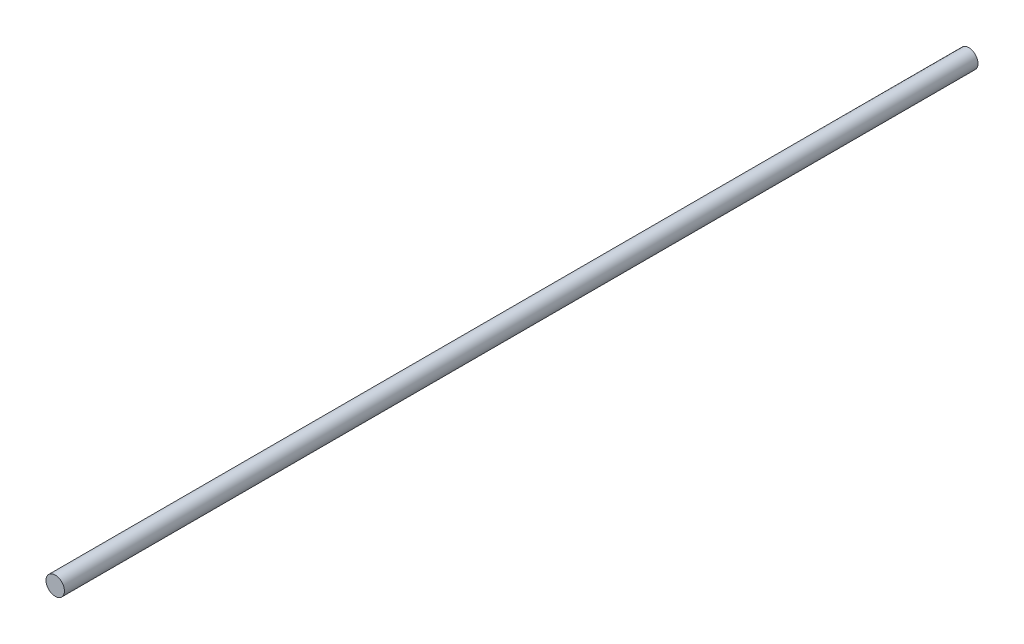
ISO-10303-21;
HEADER;
FILE_DESCRIPTION(('STEP AP214'),'2;1');
FILE_NAME('part.step','',(''),(''),'','','');
FILE_SCHEMA(('AUTOMOTIVE_DESIGN { 1 0 10303 214 1 1 1 1 }'));
ENDSEC;
DATA;
#1=APPLICATION_CONTEXT('core data for automotive mechanical design processes');
#2=APPLICATION_PROTOCOL_DEFINITION('international standard','automotive_design',2000,#1);
#3=PRODUCT_CONTEXT('',#1,'mechanical');
#4=PRODUCT('Part','Part','',(#3));
#5=PRODUCT_RELATED_PRODUCT_CATEGORY('part','',(#4));
#6=PRODUCT_DEFINITION_FORMATION('','',#4);
#7=PRODUCT_DEFINITION_CONTEXT('part definition',#1,'design');
#8=PRODUCT_DEFINITION('design','',#6,#7);
#9=PRODUCT_DEFINITION_SHAPE('','',#8);
#10=(LENGTH_UNIT() NAMED_UNIT(*) SI_UNIT(.MILLI.,.METRE.));
#11=(NAMED_UNIT(*) PLANE_ANGLE_UNIT() SI_UNIT($,.RADIAN.));
#12=(NAMED_UNIT(*) SI_UNIT($,.STERADIAN.) SOLID_ANGLE_UNIT());
#13=UNCERTAINTY_MEASURE_WITH_UNIT(LENGTH_MEASURE(1.E-05),#10,'distance_accuracy_value','');
#14=(GEOMETRIC_REPRESENTATION_CONTEXT(3) GLOBAL_UNCERTAINTY_ASSIGNED_CONTEXT((#13)) GLOBAL_UNIT_ASSIGNED_CONTEXT((#10,
#11,#12)) REPRESENTATION_CONTEXT('',''));
#15=CARTESIAN_POINT('',(0.,0.,0.));
#16=DIRECTION('',(0.,0.,1.));
#17=DIRECTION('',(1.,0.,0.));
#18=AXIS2_PLACEMENT_3D('',#15,#16,#17);
#19=CARTESIAN_POINT('',(0.,0.,198.));
#20=DIRECTION('',(0.,0.,-1.));
#21=DIRECTION('',(-1.,0.,0.));
#22=AXIS2_PLACEMENT_3D('',#19,#20,#21);
#23=CYLINDRICAL_SURFACE('',#22,4.);
#24=CARTESIAN_POINT('',(0.,0.,198.));
#25=DIRECTION('',(0.,0.,1.));
#26=DIRECTION('',(1.,0.,0.));
#27=AXIS2_PLACEMENT_3D('',#24,#25,#26);
#28=CIRCLE('',#27,4.);
#29=CARTESIAN_POINT('',(4.,0.,198.));
#30=VERTEX_POINT('',#29);
#31=EDGE_CURVE('E10',#30,#30,#28,.T.);
#32=ORIENTED_EDGE('',*,*,#31,.F.);
#33=EDGE_LOOP('',(#32));
#34=FACE_BOUND('',#33,.T.);
#35=CARTESIAN_POINT('',(0.,0.,-198.));
#36=DIRECTION('',(0.,0.,1.));
#37=DIRECTION('',(1.,0.,0.));
#38=AXIS2_PLACEMENT_3D('',#35,#36,#37);
#39=CIRCLE('',#38,4.);
#40=CARTESIAN_POINT('',(4.,0.,-198.));
#41=VERTEX_POINT('',#40);
#42=EDGE_CURVE('E34',#41,#41,#39,.T.);
#43=ORIENTED_EDGE('',*,*,#42,.T.);
#44=EDGE_LOOP('',(#43));
#45=FACE_BOUND('',#44,.T.);
#46=ADVANCED_FACE('F31',(#34,#45),#23,.T.);
#47=CARTESIAN_POINT('',(0.,0.,198.));
#48=DIRECTION('',(0.,0.,1.));
#49=DIRECTION('',(1.,0.,0.));
#50=AXIS2_PLACEMENT_3D('',#47,#48,#49);
#51=PLANE('',#50);
#52=ORIENTED_EDGE('',*,*,#31,.T.);
#53=EDGE_LOOP('',(#52));
#54=FACE_BOUND('',#53,.T.);
#55=ADVANCED_FACE('F46',(#54),#51,.T.);
#56=CARTESIAN_POINT('',(0.,0.,-198.));
#57=DIRECTION('',(0.,0.,1.));
#58=DIRECTION('',(1.,0.,0.));
#59=AXIS2_PLACEMENT_3D('',#56,#57,#58);
#60=PLANE('',#59);
#61=ORIENTED_EDGE('',*,*,#42,.F.);
#62=EDGE_LOOP('',(#61));
#63=FACE_BOUND('',#62,.T.);
#64=ADVANCED_FACE('F44',(#63),#60,.F.);
#65=CLOSED_SHELL('',(#46,#55,#64));
#66=MANIFOLD_SOLID_BREP('B2',#65);
#67=ADVANCED_BREP_SHAPE_REPRESENTATION('',(#18,#66),#14);
#68=SHAPE_DEFINITION_REPRESENTATION(#9,#67);
ENDSEC;
END-ISO-10303-21;
